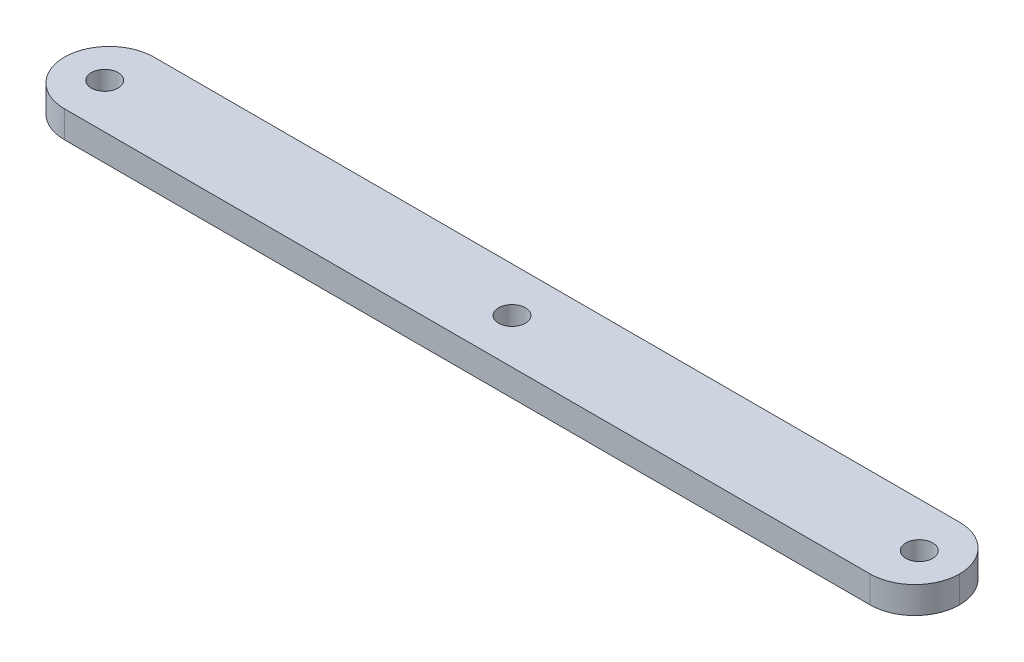
ISO-10303-21;
HEADER;
FILE_DESCRIPTION(('STEP AP214'),'2;1');
FILE_NAME('part.step','',(''),(''),'','','');
FILE_SCHEMA(('AUTOMOTIVE_DESIGN { 1 0 10303 214 1 1 1 1 }'));
ENDSEC;
DATA;
#1=APPLICATION_CONTEXT('core data for automotive mechanical design processes');
#2=APPLICATION_PROTOCOL_DEFINITION('international standard','automotive_design',2000,#1);
#3=PRODUCT_CONTEXT('',#1,'mechanical');
#4=PRODUCT('Part','Part','',(#3));
#5=PRODUCT_RELATED_PRODUCT_CATEGORY('part','',(#4));
#6=PRODUCT_DEFINITION_FORMATION('','',#4);
#7=PRODUCT_DEFINITION_CONTEXT('part definition',#1,'design');
#8=PRODUCT_DEFINITION('design','',#6,#7);
#9=PRODUCT_DEFINITION_SHAPE('','',#8);
#10=(LENGTH_UNIT() NAMED_UNIT(*) SI_UNIT(.MILLI.,.METRE.));
#11=(NAMED_UNIT(*) PLANE_ANGLE_UNIT() SI_UNIT($,.RADIAN.));
#12=(NAMED_UNIT(*) SI_UNIT($,.STERADIAN.) SOLID_ANGLE_UNIT());
#13=UNCERTAINTY_MEASURE_WITH_UNIT(LENGTH_MEASURE(1.E-05),#10,'distance_accuracy_value','');
#14=(GEOMETRIC_REPRESENTATION_CONTEXT(3) GLOBAL_UNCERTAINTY_ASSIGNED_CONTEXT((#13)) GLOBAL_UNIT_ASSIGNED_CONTEXT((#10,
#11,#12)) REPRESENTATION_CONTEXT('',''));
#15=CARTESIAN_POINT('',(0.,0.,0.));
#16=DIRECTION('',(0.,0.,1.));
#17=DIRECTION('',(1.,0.,0.));
#18=AXIS2_PLACEMENT_3D('',#15,#16,#17);
#19=CARTESIAN_POINT('',(0.,6.,0.));
#20=DIRECTION('',(0.,0.,-1.));
#21=DIRECTION('',(-1.,0.,0.));
#22=AXIS2_PLACEMENT_3D('',#19,#20,#21);
#23=PLANE('',#22);
#24=DIRECTION('',(1.,0.,0.));
#25=VECTOR('',#24,1.);
#26=CARTESIAN_POINT('',(0.,0.,0.));
#27=LINE('',#26,#25);
#28=CARTESIAN_POINT('',(10.,0.,0.));
#29=VERTEX_POINT('',#28);
#30=CARTESIAN_POINT('',(190.,0.,0.));
#31=VERTEX_POINT('',#30);
#32=EDGE_CURVE('E105',#29,#31,#27,.T.);
#33=ORIENTED_EDGE('',*,*,#32,.T.);
#34=DIRECTION('',(0.,-1.,0.));
#35=VECTOR('',#34,1.);
#36=CARTESIAN_POINT('',(190.,6.,0.));
#37=LINE('',#36,#35);
#38=CARTESIAN_POINT('',(190.,6.,0.));
#39=VERTEX_POINT('',#38);
#40=EDGE_CURVE('E11',#31,#39,#37,.F.);
#41=ORIENTED_EDGE('',*,*,#40,.T.);
#42=DIRECTION('',(1.,0.,0.));
#43=VECTOR('',#42,1.);
#44=CARTESIAN_POINT('',(0.,6.,0.));
#45=LINE('',#44,#43);
#46=CARTESIAN_POINT('',(10.,6.,0.));
#47=VERTEX_POINT('',#46);
#48=EDGE_CURVE('E160',#47,#39,#45,.T.);
#49=ORIENTED_EDGE('',*,*,#48,.F.);
#50=DIRECTION('',(0.,-1.,0.));
#51=VECTOR('',#50,1.);
#52=CARTESIAN_POINT('',(10.,6.,0.));
#53=LINE('',#52,#51);
#54=EDGE_CURVE('E135',#47,#29,#53,.T.);
#55=ORIENTED_EDGE('',*,*,#54,.T.);
#56=EDGE_LOOP('',(#33,#41,#49,#55));
#57=FACE_BOUND('',#56,.T.);
#58=ADVANCED_FACE('F42',(#57),#23,.F.);
#59=CARTESIAN_POINT('',(0.,6.,-20.));
#60=DIRECTION('',(0.,0.,1.));
#61=DIRECTION('',(1.,0.,0.));
#62=AXIS2_PLACEMENT_3D('',#59,#60,#61);
#63=PLANE('',#62);
#64=DIRECTION('',(-1.,0.,0.));
#65=VECTOR('',#64,1.);
#66=CARTESIAN_POINT('',(0.,6.,-20.));
#67=LINE('',#66,#65);
#68=CARTESIAN_POINT('',(190.,6.,-20.));
#69=VERTEX_POINT('',#68);
#70=CARTESIAN_POINT('',(10.,6.,-20.));
#71=VERTEX_POINT('',#70);
#72=EDGE_CURVE('E109',#69,#71,#67,.T.);
#73=ORIENTED_EDGE('',*,*,#72,.F.);
#74=DIRECTION('',(0.,-1.,0.));
#75=VECTOR('',#74,1.);
#76=CARTESIAN_POINT('',(190.,6.,-20.));
#77=LINE('',#76,#75);
#78=CARTESIAN_POINT('',(190.,0.,-20.));
#79=VERTEX_POINT('',#78);
#80=EDGE_CURVE('E137',#69,#79,#77,.T.);
#81=ORIENTED_EDGE('',*,*,#80,.T.);
#82=DIRECTION('',(-1.,0.,0.));
#83=VECTOR('',#82,1.);
#84=CARTESIAN_POINT('',(0.,0.,-20.));
#85=LINE('',#84,#83);
#86=CARTESIAN_POINT('',(10.,0.,-20.));
#87=VERTEX_POINT('',#86);
#88=EDGE_CURVE('E164',#79,#87,#85,.T.);
#89=ORIENTED_EDGE('',*,*,#88,.T.);
#90=DIRECTION('',(0.,-1.,0.));
#91=VECTOR('',#90,1.);
#92=CARTESIAN_POINT('',(10.,6.,-20.));
#93=LINE('',#92,#91);
#94=EDGE_CURVE('E123',#87,#71,#93,.F.);
#95=ORIENTED_EDGE('',*,*,#94,.T.);
#96=EDGE_LOOP('',(#73,#81,#89,#95));
#97=FACE_BOUND('',#96,.T.);
#98=ADVANCED_FACE('F158',(#97),#63,.F.);
#99=CARTESIAN_POINT('',(0.,6.,0.));
#100=DIRECTION('',(0.,-1.,0.));
#101=DIRECTION('',(0.,0.,-1.));
#102=AXIS2_PLACEMENT_3D('',#99,#100,#101);
#103=PLANE('',#102);
#104=CARTESIAN_POINT('',(100.,6.,-10.));
#105=DIRECTION('',(0.,1.,0.));
#106=DIRECTION('',(0.,0.,1.));
#107=AXIS2_PLACEMENT_3D('',#104,#105,#106);
#108=CIRCLE('',#107,3.00000000000001);
#109=CARTESIAN_POINT('',(100.,6.,-6.99999999999999));
#110=VERTEX_POINT('',#109);
#111=EDGE_CURVE('E170',#110,#110,#108,.T.);
#112=ORIENTED_EDGE('',*,*,#111,.F.);
#113=EDGE_LOOP('',(#112));
#114=FACE_BOUND('',#113,.T.);
#115=CARTESIAN_POINT('',(191.,6.,-10.));
#116=DIRECTION('',(0.,1.,0.));
#117=DIRECTION('',(0.,0.,1.));
#118=AXIS2_PLACEMENT_3D('',#115,#116,#117);
#119=CIRCLE('',#118,2.99999999999999);
#120=CARTESIAN_POINT('',(191.,6.,-7.00000000000001));
#121=VERTEX_POINT('',#120);
#122=EDGE_CURVE('E119',#121,#121,#119,.T.);
#123=ORIENTED_EDGE('',*,*,#122,.F.);
#124=EDGE_LOOP('',(#123));
#125=FACE_BOUND('',#124,.T.);
#126=CARTESIAN_POINT('',(9.,6.,-10.));
#127=DIRECTION('',(0.,1.,0.));
#128=DIRECTION('',(0.,0.,1.));
#129=AXIS2_PLACEMENT_3D('',#126,#127,#128);
#130=CIRCLE('',#129,3.);
#131=CARTESIAN_POINT('',(9.,6.,-7.));
#132=VERTEX_POINT('',#131);
#133=EDGE_CURVE('E182',#132,#132,#130,.T.);
#134=ORIENTED_EDGE('',*,*,#133,.F.);
#135=EDGE_LOOP('',(#134));
#136=FACE_BOUND('',#135,.T.);
#137=CARTESIAN_POINT('',(190.,6.,-10.));
#138=DIRECTION('',(0.,-1.,0.));
#139=DIRECTION('',(0.,0.,-1.));
#140=AXIS2_PLACEMENT_3D('',#137,#138,#139);
#141=CIRCLE('',#140,10.);
#142=CARTESIAN_POINT('',(200.,6.,-10.));
#143=VERTEX_POINT('',#142);
#144=EDGE_CURVE('E59',#39,#143,#141,.F.);
#145=ORIENTED_EDGE('',*,*,#144,.T.);
#146=CARTESIAN_POINT('',(190.,6.,-10.));
#147=DIRECTION('',(0.,-1.,0.));
#148=DIRECTION('',(0.,0.,-1.));
#149=AXIS2_PLACEMENT_3D('',#146,#147,#148);
#150=CIRCLE('',#149,10.);
#151=EDGE_CURVE('E52',#143,#69,#150,.F.);
#152=ORIENTED_EDGE('',*,*,#151,.T.);
#153=ORIENTED_EDGE('',*,*,#72,.T.);
#154=CARTESIAN_POINT('',(10.,6.,-10.));
#155=DIRECTION('',(0.,-1.,0.));
#156=DIRECTION('',(0.,0.,-1.));
#157=AXIS2_PLACEMENT_3D('',#154,#155,#156);
#158=CIRCLE('',#157,10.);
#159=CARTESIAN_POINT('',(0.,6.,-10.));
#160=VERTEX_POINT('',#159);
#161=EDGE_CURVE('E132',#71,#160,#158,.F.);
#162=ORIENTED_EDGE('',*,*,#161,.T.);
#163=CARTESIAN_POINT('',(10.,6.,-10.));
#164=DIRECTION('',(0.,-1.,0.));
#165=DIRECTION('',(0.,0.,-1.));
#166=AXIS2_PLACEMENT_3D('',#163,#164,#165);
#167=CIRCLE('',#166,10.);
#168=EDGE_CURVE('E115',#160,#47,#167,.F.);
#169=ORIENTED_EDGE('',*,*,#168,.T.);
#170=ORIENTED_EDGE('',*,*,#48,.T.);
#171=EDGE_LOOP('',(#145,#152,#153,#162,#169,#170));
#172=FACE_BOUND('',#171,.T.);
#173=ADVANCED_FACE('F153',(#114,#125,#136,#172),#103,.F.);
#174=CARTESIAN_POINT('',(0.,0.,0.));
#175=DIRECTION('',(0.,-1.,0.));
#176=DIRECTION('',(0.,0.,-1.));
#177=AXIS2_PLACEMENT_3D('',#174,#175,#176);
#178=PLANE('',#177);
#179=CARTESIAN_POINT('',(100.,0.,-10.));
#180=DIRECTION('',(0.,1.,0.));
#181=DIRECTION('',(0.,0.,1.));
#182=AXIS2_PLACEMENT_3D('',#179,#180,#181);
#183=CIRCLE('',#182,3.00000000000001);
#184=CARTESIAN_POINT('',(100.,0.,-6.99999999999999));
#185=VERTEX_POINT('',#184);
#186=EDGE_CURVE('E167',#185,#185,#183,.T.);
#187=ORIENTED_EDGE('',*,*,#186,.T.);
#188=EDGE_LOOP('',(#187));
#189=FACE_BOUND('',#188,.T.);
#190=CARTESIAN_POINT('',(191.,0.,-10.));
#191=DIRECTION('',(0.,1.,0.));
#192=DIRECTION('',(0.,0.,1.));
#193=AXIS2_PLACEMENT_3D('',#190,#191,#192);
#194=CIRCLE('',#193,2.99999999999999);
#195=CARTESIAN_POINT('',(191.,0.,-7.00000000000001));
#196=VERTEX_POINT('',#195);
#197=EDGE_CURVE('E178',#196,#196,#194,.T.);
#198=ORIENTED_EDGE('',*,*,#197,.T.);
#199=EDGE_LOOP('',(#198));
#200=FACE_BOUND('',#199,.T.);
#201=CARTESIAN_POINT('',(9.,0.,-10.));
#202=DIRECTION('',(0.,1.,0.));
#203=DIRECTION('',(0.,0.,1.));
#204=AXIS2_PLACEMENT_3D('',#201,#202,#203);
#205=CIRCLE('',#204,3.);
#206=CARTESIAN_POINT('',(9.,0.,-7.));
#207=VERTEX_POINT('',#206);
#208=EDGE_CURVE('E186',#207,#207,#205,.T.);
#209=ORIENTED_EDGE('',*,*,#208,.T.);
#210=EDGE_LOOP('',(#209));
#211=FACE_BOUND('',#210,.T.);
#212=ORIENTED_EDGE('',*,*,#88,.F.);
#213=CARTESIAN_POINT('',(190.,0.,-10.));
#214=DIRECTION('',(0.,-1.,0.));
#215=DIRECTION('',(0.,0.,-1.));
#216=AXIS2_PLACEMENT_3D('',#213,#214,#215);
#217=CIRCLE('',#216,10.);
#218=CARTESIAN_POINT('',(200.,0.,-10.));
#219=VERTEX_POINT('',#218);
#220=EDGE_CURVE('E145',#79,#219,#217,.T.);
#221=ORIENTED_EDGE('',*,*,#220,.T.);
#222=CARTESIAN_POINT('',(190.,0.,-10.));
#223=DIRECTION('',(0.,-1.,0.));
#224=DIRECTION('',(0.,0.,-1.));
#225=AXIS2_PLACEMENT_3D('',#222,#223,#224);
#226=CIRCLE('',#225,10.);
#227=EDGE_CURVE('E142',#219,#31,#226,.T.);
#228=ORIENTED_EDGE('',*,*,#227,.T.);
#229=ORIENTED_EDGE('',*,*,#32,.F.);
#230=CARTESIAN_POINT('',(10.,0.,-10.));
#231=DIRECTION('',(0.,-1.,0.));
#232=DIRECTION('',(0.,0.,-1.));
#233=AXIS2_PLACEMENT_3D('',#230,#231,#232);
#234=CIRCLE('',#233,10.);
#235=CARTESIAN_POINT('',(0.,0.,-10.));
#236=VERTEX_POINT('',#235);
#237=EDGE_CURVE('E98',#29,#236,#234,.T.);
#238=ORIENTED_EDGE('',*,*,#237,.T.);
#239=CARTESIAN_POINT('',(10.,0.,-10.));
#240=DIRECTION('',(0.,-1.,0.));
#241=DIRECTION('',(0.,0.,-1.));
#242=AXIS2_PLACEMENT_3D('',#239,#240,#241);
#243=CIRCLE('',#242,10.);
#244=EDGE_CURVE('E103',#236,#87,#243,.T.);
#245=ORIENTED_EDGE('',*,*,#244,.T.);
#246=EDGE_LOOP('',(#212,#221,#228,#229,#238,#245));
#247=FACE_BOUND('',#246,.T.);
#248=ADVANCED_FACE('F101',(#189,#200,#211,#247),#178,.T.);
#249=CARTESIAN_POINT('',(9.,0.,-10.));
#250=DIRECTION('',(0.,1.,0.));
#251=DIRECTION('',(0.,0.,1.));
#252=AXIS2_PLACEMENT_3D('',#249,#250,#251);
#253=CYLINDRICAL_SURFACE('',#252,3.);
#254=ORIENTED_EDGE('',*,*,#208,.F.);
#255=EDGE_LOOP('',(#254));
#256=FACE_BOUND('',#255,.T.);
#257=ORIENTED_EDGE('',*,*,#133,.T.);
#258=EDGE_LOOP('',(#257));
#259=FACE_BOUND('',#258,.T.);
#260=ADVANCED_FACE('F234',(#256,#259),#253,.F.);
#261=CARTESIAN_POINT('',(191.,0.,-10.));
#262=DIRECTION('',(0.,1.,0.));
#263=DIRECTION('',(0.,0.,1.));
#264=AXIS2_PLACEMENT_3D('',#261,#262,#263);
#265=CYLINDRICAL_SURFACE('',#264,2.99999999999999);
#266=ORIENTED_EDGE('',*,*,#197,.F.);
#267=EDGE_LOOP('',(#266));
#268=FACE_BOUND('',#267,.T.);
#269=ORIENTED_EDGE('',*,*,#122,.T.);
#270=EDGE_LOOP('',(#269));
#271=FACE_BOUND('',#270,.T.);
#272=ADVANCED_FACE('F208',(#268,#271),#265,.F.);
#273=CARTESIAN_POINT('',(10.,6.,-10.));
#274=DIRECTION('',(0.,-1.,0.));
#275=DIRECTION('',(0.,0.,-1.));
#276=AXIS2_PLACEMENT_3D('',#273,#274,#275);
#277=CYLINDRICAL_SURFACE('',#276,10.);
#278=ORIENTED_EDGE('',*,*,#54,.F.);
#279=ORIENTED_EDGE('',*,*,#168,.F.);
#280=DIRECTION('',(0.,-1.,0.));
#281=VECTOR('',#280,1.);
#282=CARTESIAN_POINT('',(0.,6.,-10.));
#283=LINE('',#282,#281);
#284=EDGE_CURVE('E113',#236,#160,#283,.F.);
#285=ORIENTED_EDGE('',*,*,#284,.F.);
#286=ORIENTED_EDGE('',*,*,#237,.F.);
#287=EDGE_LOOP('',(#278,#279,#285,#286));
#288=FACE_BOUND('',#287,.T.);
#289=ADVANCED_FACE('F114',(#288),#277,.T.);
#290=CARTESIAN_POINT('',(10.,6.,-10.));
#291=DIRECTION('',(0.,-1.,0.));
#292=DIRECTION('',(0.,0.,-1.));
#293=AXIS2_PLACEMENT_3D('',#290,#291,#292);
#294=CYLINDRICAL_SURFACE('',#293,10.);
#295=ORIENTED_EDGE('',*,*,#161,.F.);
#296=ORIENTED_EDGE('',*,*,#94,.F.);
#297=ORIENTED_EDGE('',*,*,#244,.F.);
#298=ORIENTED_EDGE('',*,*,#284,.T.);
#299=EDGE_LOOP('',(#295,#296,#297,#298));
#300=FACE_BOUND('',#299,.T.);
#301=ADVANCED_FACE('F121',(#300),#294,.T.);
#302=CARTESIAN_POINT('',(190.,6.,-10.));
#303=DIRECTION('',(0.,-1.,0.));
#304=DIRECTION('',(0.,0.,-1.));
#305=AXIS2_PLACEMENT_3D('',#302,#303,#304);
#306=CYLINDRICAL_SURFACE('',#305,10.);
#307=DIRECTION('',(0.,-1.,0.));
#308=VECTOR('',#307,1.);
#309=CARTESIAN_POINT('',(200.,6.,-10.));
#310=LINE('',#309,#308);
#311=EDGE_CURVE('E46',#143,#219,#310,.T.);
#312=ORIENTED_EDGE('',*,*,#311,.F.);
#313=ORIENTED_EDGE('',*,*,#144,.F.);
#314=ORIENTED_EDGE('',*,*,#40,.F.);
#315=ORIENTED_EDGE('',*,*,#227,.F.);
#316=EDGE_LOOP('',(#312,#313,#314,#315));
#317=FACE_BOUND('',#316,.T.);
#318=ADVANCED_FACE('F44',(#317),#306,.T.);
#319=CARTESIAN_POINT('',(190.,6.,-10.));
#320=DIRECTION('',(0.,-1.,0.));
#321=DIRECTION('',(0.,0.,-1.));
#322=AXIS2_PLACEMENT_3D('',#319,#320,#321);
#323=CYLINDRICAL_SURFACE('',#322,10.);
#324=ORIENTED_EDGE('',*,*,#151,.F.);
#325=ORIENTED_EDGE('',*,*,#311,.T.);
#326=ORIENTED_EDGE('',*,*,#220,.F.);
#327=ORIENTED_EDGE('',*,*,#80,.F.);
#328=EDGE_LOOP('',(#324,#325,#326,#327));
#329=FACE_BOUND('',#328,.T.);
#330=ADVANCED_FACE('F162',(#329),#323,.T.);
#331=CARTESIAN_POINT('',(100.,0.,-10.));
#332=DIRECTION('',(0.,1.,0.));
#333=DIRECTION('',(0.,0.,1.));
#334=AXIS2_PLACEMENT_3D('',#331,#332,#333);
#335=CYLINDRICAL_SURFACE('',#334,3.00000000000001);
#336=ORIENTED_EDGE('',*,*,#186,.F.);
#337=EDGE_LOOP('',(#336));
#338=FACE_BOUND('',#337,.T.);
#339=ORIENTED_EDGE('',*,*,#111,.T.);
#340=EDGE_LOOP('',(#339));
#341=FACE_BOUND('',#340,.T.);
#342=ADVANCED_FACE('F210',(#338,#341),#335,.F.);
#343=CLOSED_SHELL('',(#58,#98,#173,#248,#260,#272,#289,#301,#318,#330,#342));
#344=MANIFOLD_SOLID_BREP('B2',#343);
#345=ADVANCED_BREP_SHAPE_REPRESENTATION('',(#18,#344),#14);
#346=SHAPE_DEFINITION_REPRESENTATION(#9,#345);
ENDSEC;
END-ISO-10303-21;
